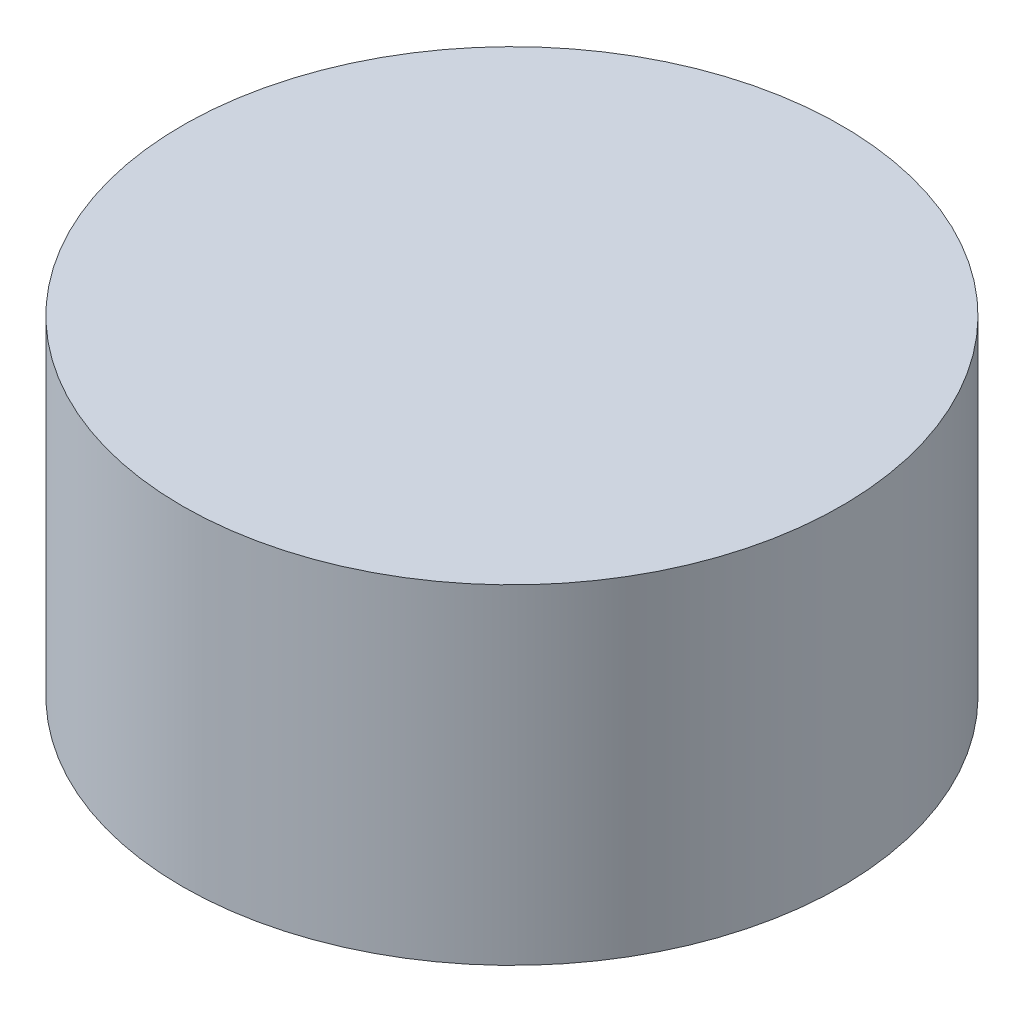
ISO-10303-21;
HEADER;
FILE_DESCRIPTION(('STEP AP214'),'2;1');
FILE_NAME('part.step','',(''),(''),'','','');
FILE_SCHEMA(('AUTOMOTIVE_DESIGN { 1 0 10303 214 1 1 1 1 }'));
ENDSEC;
DATA;
#1=APPLICATION_CONTEXT('core data for automotive mechanical design processes');
#2=APPLICATION_PROTOCOL_DEFINITION('international standard','automotive_design',2000,#1);
#3=PRODUCT_CONTEXT('',#1,'mechanical');
#4=PRODUCT('Part','Part','',(#3));
#5=PRODUCT_RELATED_PRODUCT_CATEGORY('part','',(#4));
#6=PRODUCT_DEFINITION_FORMATION('','',#4);
#7=PRODUCT_DEFINITION_CONTEXT('part definition',#1,'design');
#8=PRODUCT_DEFINITION('design','',#6,#7);
#9=PRODUCT_DEFINITION_SHAPE('','',#8);
#10=(LENGTH_UNIT() NAMED_UNIT(*) SI_UNIT(.MILLI.,.METRE.));
#11=(NAMED_UNIT(*) PLANE_ANGLE_UNIT() SI_UNIT($,.RADIAN.));
#12=(NAMED_UNIT(*) SI_UNIT($,.STERADIAN.) SOLID_ANGLE_UNIT());
#13=UNCERTAINTY_MEASURE_WITH_UNIT(LENGTH_MEASURE(1.E-05),#10,'distance_accuracy_value','');
#14=(GEOMETRIC_REPRESENTATION_CONTEXT(3) GLOBAL_UNCERTAINTY_ASSIGNED_CONTEXT((#13)) GLOBAL_UNIT_ASSIGNED_CONTEXT((#10,
#11,#12)) REPRESENTATION_CONTEXT('',''));
#15=CARTESIAN_POINT('',(0.,0.,0.));
#16=DIRECTION('',(0.,0.,1.));
#17=DIRECTION('',(1.,0.,0.));
#18=AXIS2_PLACEMENT_3D('',#15,#16,#17);
#19=CARTESIAN_POINT('',(0.,12.,0.));
#20=DIRECTION('',(0.,-1.,0.));
#21=DIRECTION('',(0.,0.,-1.));
#22=AXIS2_PLACEMENT_3D('',#19,#20,#21);
#23=CYLINDRICAL_SURFACE('',#22,12.);
#24=CARTESIAN_POINT('',(0.,12.,0.));
#25=DIRECTION('',(0.,1.,0.));
#26=DIRECTION('',(0.,0.,1.));
#27=AXIS2_PLACEMENT_3D('',#24,#25,#26);
#28=CIRCLE('',#27,12.);
#29=CARTESIAN_POINT('',(0.,12.,12.));
#30=VERTEX_POINT('',#29);
#31=EDGE_CURVE('E10',#30,#30,#28,.T.);
#32=ORIENTED_EDGE('',*,*,#31,.F.);
#33=EDGE_LOOP('',(#32));
#34=FACE_BOUND('',#33,.T.);
#35=CARTESIAN_POINT('',(0.,0.,0.));
#36=DIRECTION('',(0.,1.,0.));
#37=DIRECTION('',(0.,0.,1.));
#38=AXIS2_PLACEMENT_3D('',#35,#36,#37);
#39=CIRCLE('',#38,12.);
#40=CARTESIAN_POINT('',(0.,0.,12.));
#41=VERTEX_POINT('',#40);
#42=EDGE_CURVE('E34',#41,#41,#39,.T.);
#43=ORIENTED_EDGE('',*,*,#42,.T.);
#44=EDGE_LOOP('',(#43));
#45=FACE_BOUND('',#44,.T.);
#46=ADVANCED_FACE('F31',(#34,#45),#23,.T.);
#47=CARTESIAN_POINT('',(0.,12.,0.));
#48=DIRECTION('',(0.,1.,0.));
#49=DIRECTION('',(0.,0.,1.));
#50=AXIS2_PLACEMENT_3D('',#47,#48,#49);
#51=PLANE('',#50);
#52=ORIENTED_EDGE('',*,*,#31,.T.);
#53=EDGE_LOOP('',(#52));
#54=FACE_BOUND('',#53,.T.);
#55=ADVANCED_FACE('F46',(#54),#51,.T.);
#56=CARTESIAN_POINT('',(0.,0.,0.));
#57=DIRECTION('',(0.,1.,0.));
#58=DIRECTION('',(0.,0.,1.));
#59=AXIS2_PLACEMENT_3D('',#56,#57,#58);
#60=PLANE('',#59);
#61=ORIENTED_EDGE('',*,*,#42,.F.);
#62=EDGE_LOOP('',(#61));
#63=FACE_BOUND('',#62,.T.);
#64=ADVANCED_FACE('F44',(#63),#60,.F.);
#65=CLOSED_SHELL('',(#46,#55,#64));
#66=MANIFOLD_SOLID_BREP('B2',#65);
#67=ADVANCED_BREP_SHAPE_REPRESENTATION('',(#18,#66),#14);
#68=SHAPE_DEFINITION_REPRESENTATION(#9,#67);
ENDSEC;
END-ISO-10303-21;
